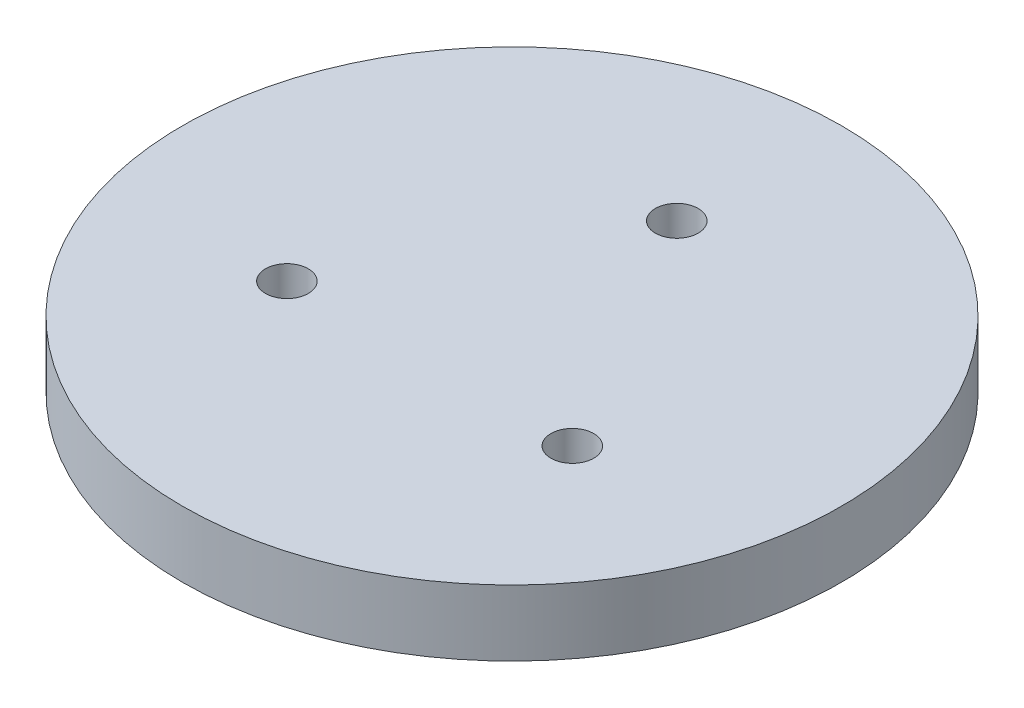
ISO-10303-21;
HEADER;
FILE_DESCRIPTION(('STEP AP214'),'2;1');
FILE_NAME('part.step','',(''),(''),'','','');
FILE_SCHEMA(('AUTOMOTIVE_DESIGN { 1 0 10303 214 1 1 1 1 }'));
ENDSEC;
DATA;
#1=APPLICATION_CONTEXT('core data for automotive mechanical design processes');
#2=APPLICATION_PROTOCOL_DEFINITION('international standard','automotive_design',2000,#1);
#3=PRODUCT_CONTEXT('',#1,'mechanical');
#4=PRODUCT('Part','Part','',(#3));
#5=PRODUCT_RELATED_PRODUCT_CATEGORY('part','',(#4));
#6=PRODUCT_DEFINITION_FORMATION('','',#4);
#7=PRODUCT_DEFINITION_CONTEXT('part definition',#1,'design');
#8=PRODUCT_DEFINITION('design','',#6,#7);
#9=PRODUCT_DEFINITION_SHAPE('','',#8);
#10=(LENGTH_UNIT() NAMED_UNIT(*) SI_UNIT(.MILLI.,.METRE.));
#11=(NAMED_UNIT(*) PLANE_ANGLE_UNIT() SI_UNIT($,.RADIAN.));
#12=(NAMED_UNIT(*) SI_UNIT($,.STERADIAN.) SOLID_ANGLE_UNIT());
#13=UNCERTAINTY_MEASURE_WITH_UNIT(LENGTH_MEASURE(1.E-05),#10,'distance_accuracy_value','');
#14=(GEOMETRIC_REPRESENTATION_CONTEXT(3) GLOBAL_UNCERTAINTY_ASSIGNED_CONTEXT((#13)) GLOBAL_UNIT_ASSIGNED_CONTEXT((#10,
#11,#12)) REPRESENTATION_CONTEXT('',''));
#15=CARTESIAN_POINT('',(0.,0.,0.));
#16=DIRECTION('',(0.,0.,1.));
#17=DIRECTION('',(1.,0.,0.));
#18=AXIS2_PLACEMENT_3D('',#15,#16,#17);
#19=CARTESIAN_POINT('',(0.,10.,0.));
#20=DIRECTION('',(0.,1.,0.));
#21=DIRECTION('',(0.,0.,1.));
#22=AXIS2_PLACEMENT_3D('',#19,#20,#21);
#23=PLANE('',#22);
#24=CARTESIAN_POINT('',(21.6506350946123,10.,12.4999999999993));
#25=DIRECTION('',(0.,1.,0.));
#26=DIRECTION('',(0.,0.,1.));
#27=AXIS2_PLACEMENT_3D('',#24,#25,#26);
#28=CIRCLE('',#27,3.25);
#29=CARTESIAN_POINT('',(21.6506350946123,10.,15.7499999999993));
#30=VERTEX_POINT('',#29);
#31=EDGE_CURVE('E47',#30,#30,#28,.T.);
#32=ORIENTED_EDGE('',*,*,#31,.F.);
#33=EDGE_LOOP('',(#32));
#34=FACE_BOUND('',#33,.T.);
#35=CARTESIAN_POINT('',(0.,10.,0.));
#36=DIRECTION('',(0.,1.,0.));
#37=DIRECTION('',(0.,0.,1.));
#38=AXIS2_PLACEMENT_3D('',#35,#36,#37);
#39=CIRCLE('',#38,50.);
#40=CARTESIAN_POINT('',(0.,10.,50.));
#41=VERTEX_POINT('',#40);
#42=EDGE_CURVE('E10',#41,#41,#39,.T.);
#43=ORIENTED_EDGE('',*,*,#42,.T.);
#44=EDGE_LOOP('',(#43));
#45=FACE_BOUND('',#44,.T.);
#46=CARTESIAN_POINT('',(0.,10.,-25.));
#47=DIRECTION('',(0.,1.,0.));
#48=DIRECTION('',(0.,0.,1.));
#49=AXIS2_PLACEMENT_3D('',#46,#47,#48);
#50=CIRCLE('',#49,3.25);
#51=CARTESIAN_POINT('',(0.,10.,-21.75));
#52=VERTEX_POINT('',#51);
#53=EDGE_CURVE('E42',#52,#52,#50,.T.);
#54=ORIENTED_EDGE('',*,*,#53,.F.);
#55=EDGE_LOOP('',(#54));
#56=FACE_BOUND('',#55,.T.);
#57=CARTESIAN_POINT('',(-21.6506350946097,10.,12.5000000000007));
#58=DIRECTION('',(0.,1.,0.));
#59=DIRECTION('',(0.,0.,1.));
#60=AXIS2_PLACEMENT_3D('',#57,#58,#59);
#61=CIRCLE('',#60,3.25);
#62=CARTESIAN_POINT('',(-21.6506350946097,10.,15.7500000000007));
#63=VERTEX_POINT('',#62);
#64=EDGE_CURVE('E53',#63,#63,#61,.T.);
#65=ORIENTED_EDGE('',*,*,#64,.F.);
#66=EDGE_LOOP('',(#65));
#67=FACE_BOUND('',#66,.T.);
#68=ADVANCED_FACE('F31',(#34,#45,#56,#67),#23,.T.);
#69=CARTESIAN_POINT('',(0.,0.,0.));
#70=DIRECTION('',(0.,1.,0.));
#71=DIRECTION('',(0.,0.,1.));
#72=AXIS2_PLACEMENT_3D('',#69,#70,#71);
#73=PLANE('',#72);
#74=CARTESIAN_POINT('',(0.,0.,0.));
#75=DIRECTION('',(0.,1.,0.));
#76=DIRECTION('',(0.,0.,1.));
#77=AXIS2_PLACEMENT_3D('',#74,#75,#76);
#78=CIRCLE('',#77,50.);
#79=CARTESIAN_POINT('',(0.,0.,50.));
#80=VERTEX_POINT('',#79);
#81=EDGE_CURVE('E35',#80,#80,#78,.T.);
#82=ORIENTED_EDGE('',*,*,#81,.F.);
#83=EDGE_LOOP('',(#82));
#84=FACE_BOUND('',#83,.T.);
#85=CARTESIAN_POINT('',(0.,0.,-25.));
#86=DIRECTION('',(0.,1.,0.));
#87=DIRECTION('',(0.,0.,1.));
#88=AXIS2_PLACEMENT_3D('',#85,#86,#87);
#89=CIRCLE('',#88,3.25);
#90=CARTESIAN_POINT('',(0.,0.,-21.75));
#91=VERTEX_POINT('',#90);
#92=EDGE_CURVE('E44',#91,#91,#89,.T.);
#93=ORIENTED_EDGE('',*,*,#92,.T.);
#94=EDGE_LOOP('',(#93));
#95=FACE_BOUND('',#94,.T.);
#96=CARTESIAN_POINT('',(21.6506350946123,0.,12.4999999999993));
#97=DIRECTION('',(0.,1.,0.));
#98=DIRECTION('',(0.,0.,1.));
#99=AXIS2_PLACEMENT_3D('',#96,#97,#98);
#100=CIRCLE('',#99,3.25);
#101=CARTESIAN_POINT('',(21.6506350946123,0.,15.7499999999993));
#102=VERTEX_POINT('',#101);
#103=EDGE_CURVE('E50',#102,#102,#100,.T.);
#104=ORIENTED_EDGE('',*,*,#103,.T.);
#105=EDGE_LOOP('',(#104));
#106=FACE_BOUND('',#105,.T.);
#107=CARTESIAN_POINT('',(-21.6506350946097,0.,12.5000000000007));
#108=DIRECTION('',(0.,1.,0.));
#109=DIRECTION('',(0.,0.,1.));
#110=AXIS2_PLACEMENT_3D('',#107,#108,#109);
#111=CIRCLE('',#110,3.25);
#112=CARTESIAN_POINT('',(-21.6506350946097,0.,15.7500000000007));
#113=VERTEX_POINT('',#112);
#114=EDGE_CURVE('E56',#113,#113,#111,.T.);
#115=ORIENTED_EDGE('',*,*,#114,.T.);
#116=EDGE_LOOP('',(#115));
#117=FACE_BOUND('',#116,.T.);
#118=ADVANCED_FACE('F66',(#84,#95,#106,#117),#73,.F.);
#119=CARTESIAN_POINT('',(0.,10.,0.));
#120=DIRECTION('',(0.,-1.,0.));
#121=DIRECTION('',(0.,0.,-1.));
#122=AXIS2_PLACEMENT_3D('',#119,#120,#121);
#123=CYLINDRICAL_SURFACE('',#122,50.);
#124=ORIENTED_EDGE('',*,*,#42,.F.);
#125=EDGE_LOOP('',(#124));
#126=FACE_BOUND('',#125,.T.);
#127=ORIENTED_EDGE('',*,*,#81,.T.);
#128=EDGE_LOOP('',(#127));
#129=FACE_BOUND('',#128,.T.);
#130=ADVANCED_FACE('F33',(#126,#129),#123,.T.);
#131=CARTESIAN_POINT('',(0.,10.,-25.));
#132=DIRECTION('',(0.,-1.,0.));
#133=DIRECTION('',(0.,0.,-1.));
#134=AXIS2_PLACEMENT_3D('',#131,#132,#133);
#135=CYLINDRICAL_SURFACE('',#134,3.25);
#136=ORIENTED_EDGE('',*,*,#53,.T.);
#137=EDGE_LOOP('',(#136));
#138=FACE_BOUND('',#137,.T.);
#139=ORIENTED_EDGE('',*,*,#92,.F.);
#140=EDGE_LOOP('',(#139));
#141=FACE_BOUND('',#140,.T.);
#142=ADVANCED_FACE('F75',(#138,#141),#135,.F.);
#143=CARTESIAN_POINT('',(21.6506350946123,10.,12.4999999999993));
#144=DIRECTION('',(0.,-1.,0.));
#145=DIRECTION('',(0.,0.,-1.));
#146=AXIS2_PLACEMENT_3D('',#143,#144,#145);
#147=CYLINDRICAL_SURFACE('',#146,3.25);
#148=ORIENTED_EDGE('',*,*,#31,.T.);
#149=EDGE_LOOP('',(#148));
#150=FACE_BOUND('',#149,.T.);
#151=ORIENTED_EDGE('',*,*,#103,.F.);
#152=EDGE_LOOP('',(#151));
#153=FACE_BOUND('',#152,.T.);
#154=ADVANCED_FACE('F78',(#150,#153),#147,.F.);
#155=CARTESIAN_POINT('',(-21.6506350946097,10.,12.5000000000007));
#156=DIRECTION('',(0.,-1.,0.));
#157=DIRECTION('',(0.,0.,-1.));
#158=AXIS2_PLACEMENT_3D('',#155,#156,#157);
#159=CYLINDRICAL_SURFACE('',#158,3.25);
#160=ORIENTED_EDGE('',*,*,#64,.T.);
#161=EDGE_LOOP('',(#160));
#162=FACE_BOUND('',#161,.T.);
#163=ORIENTED_EDGE('',*,*,#114,.F.);
#164=EDGE_LOOP('',(#163));
#165=FACE_BOUND('',#164,.T.);
#166=ADVANCED_FACE('F62',(#162,#165),#159,.F.);
#167=CLOSED_SHELL('',(#68,#118,#130,#142,#154,#166));
#168=MANIFOLD_SOLID_BREP('B2',#167);
#169=ADVANCED_BREP_SHAPE_REPRESENTATION('',(#18,#168),#14);
#170=SHAPE_DEFINITION_REPRESENTATION(#9,#169);
ENDSEC;
END-ISO-10303-21;
